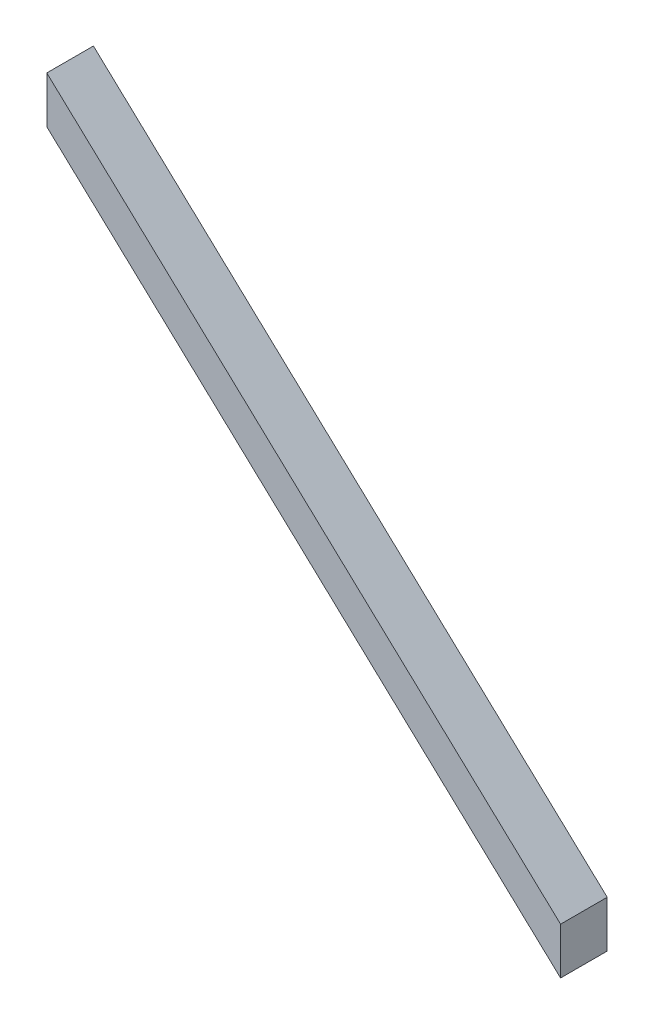
ISO-10303-21;
HEADER;
FILE_DESCRIPTION(('STEP AP214'),'2;1');
FILE_NAME('part.step','',(''),(''),'','','');
FILE_SCHEMA(('AUTOMOTIVE_DESIGN { 1 0 10303 214 1 1 1 1 }'));
ENDSEC;
DATA;
#1=APPLICATION_CONTEXT('core data for automotive mechanical design processes');
#2=APPLICATION_PROTOCOL_DEFINITION('international standard','automotive_design',2000,#1);
#3=PRODUCT_CONTEXT('',#1,'mechanical');
#4=PRODUCT('Part','Part','',(#3));
#5=PRODUCT_RELATED_PRODUCT_CATEGORY('part','',(#4));
#6=PRODUCT_DEFINITION_FORMATION('','',#4);
#7=PRODUCT_DEFINITION_CONTEXT('part definition',#1,'design');
#8=PRODUCT_DEFINITION('design','',#6,#7);
#9=PRODUCT_DEFINITION_SHAPE('','',#8);
#10=(LENGTH_UNIT() NAMED_UNIT(*) SI_UNIT(.MILLI.,.METRE.));
#11=(NAMED_UNIT(*) PLANE_ANGLE_UNIT() SI_UNIT($,.RADIAN.));
#12=(NAMED_UNIT(*) SI_UNIT($,.STERADIAN.) SOLID_ANGLE_UNIT());
#13=UNCERTAINTY_MEASURE_WITH_UNIT(LENGTH_MEASURE(1.E-05),#10,'distance_accuracy_value','');
#14=(GEOMETRIC_REPRESENTATION_CONTEXT(3) GLOBAL_UNCERTAINTY_ASSIGNED_CONTEXT((#13)) GLOBAL_UNIT_ASSIGNED_CONTEXT((#10,
#11,#12)) REPRESENTATION_CONTEXT('',''));
#15=CARTESIAN_POINT('',(0.,0.,0.));
#16=DIRECTION('',(0.,0.,1.));
#17=DIRECTION('',(1.,0.,0.));
#18=AXIS2_PLACEMENT_3D('',#15,#16,#17);
#19=CARTESIAN_POINT('',(21.5982552132406,185.289284442551,-8.00999999999998));
#20=DIRECTION('',(1.,0.,0.));
#21=DIRECTION('',(0.,0.,-1.));
#22=AXIS2_PLACEMENT_3D('',#19,#20,#21);
#23=PLANE('',#22);
#24=DIRECTION('',(0.,-1.,0.));
#25=VECTOR('',#24,1.);
#26=CARTESIAN_POINT('',(21.5982552132406,192.880197559472,-7.99999999999999));
#27=LINE('',#26,#25);
#28=CARTESIAN_POINT('',(21.5982552132406,193.289284442551,-7.99999999999998));
#29=VERTEX_POINT('',#28);
#30=CARTESIAN_POINT('',(21.5982552132406,185.289284442551,-7.99999999999998));
#31=VERTEX_POINT('',#30);
#32=EDGE_CURVE('E48',#29,#31,#27,.T.);
#33=ORIENTED_EDGE('',*,*,#32,.T.);
#34=DIRECTION('',(0.,0.,1.));
#35=VECTOR('',#34,1.);
#36=CARTESIAN_POINT('',(21.5982552132406,185.289284442551,-7.99999999999998));
#37=LINE('',#36,#35);
#38=CARTESIAN_POINT('',(21.5982552132406,185.289284442551,0.));
#39=VERTEX_POINT('',#38);
#40=EDGE_CURVE('E92',#39,#31,#37,.F.);
#41=ORIENTED_EDGE('',*,*,#40,.F.);
#42=DIRECTION('',(0.,-1.,0.));
#43=VECTOR('',#42,1.);
#44=CARTESIAN_POINT('',(21.5982552132406,0.,0.));
#45=LINE('',#44,#43);
#46=CARTESIAN_POINT('',(21.5982552132406,193.289284442551,0.));
#47=VERTEX_POINT('',#46);
#48=EDGE_CURVE('E110',#47,#39,#45,.T.);
#49=ORIENTED_EDGE('',*,*,#48,.F.);
#50=DIRECTION('',(0.,0.,-1.));
#51=VECTOR('',#50,1.);
#52=CARTESIAN_POINT('',(21.5982552132406,193.289284442551,-174.481230173254));
#53=LINE('',#52,#51);
#54=EDGE_CURVE('E12',#47,#29,#53,.T.);
#55=ORIENTED_EDGE('',*,*,#54,.T.);
#56=EDGE_LOOP('',(#33,#41,#49,#55));
#57=FACE_BOUND('',#56,.T.);
#58=ADVANCED_FACE('F45',(#57),#23,.F.);
#59=CARTESIAN_POINT('',(109.756813274208,110.880197559472,-174.481230173254));
#60=DIRECTION('',(1.,0.,0.));
#61=DIRECTION('',(0.,0.,-1.));
#62=AXIS2_PLACEMENT_3D('',#59,#60,#61);
#63=PLANE('',#62);
#64=DIRECTION('',(0.,0.,1.));
#65=VECTOR('',#64,1.);
#66=CARTESIAN_POINT('',(109.756813274208,102.880197559472,-174.481230173254));
#67=LINE('',#66,#65);
#68=CARTESIAN_POINT('',(109.756813274208,102.880197559472,-7.99999999999998));
#69=VERTEX_POINT('',#68);
#70=CARTESIAN_POINT('',(109.756813274208,102.880197559472,0.));
#71=VERTEX_POINT('',#70);
#72=EDGE_CURVE('E89',#69,#71,#67,.T.);
#73=ORIENTED_EDGE('',*,*,#72,.F.);
#74=DIRECTION('',(0.,1.,0.));
#75=VECTOR('',#74,1.);
#76=CARTESIAN_POINT('',(109.756813274208,110.880197559472,-7.99999999999998));
#77=LINE('',#76,#75);
#78=CARTESIAN_POINT('',(109.756813274208,110.880197559472,-7.99999999999998));
#79=VERTEX_POINT('',#78);
#80=EDGE_CURVE('E97',#69,#79,#77,.T.);
#81=ORIENTED_EDGE('',*,*,#80,.T.);
#82=DIRECTION('',(0.,0.,1.));
#83=VECTOR('',#82,1.);
#84=CARTESIAN_POINT('',(109.756813274208,110.880197559472,-174.481230173254));
#85=LINE('',#84,#83);
#86=CARTESIAN_POINT('',(109.756813274208,110.880197559472,0.));
#87=VERTEX_POINT('',#86);
#88=EDGE_CURVE('E102',#79,#87,#85,.T.);
#89=ORIENTED_EDGE('',*,*,#88,.T.);
#90=DIRECTION('',(0.,1.,0.));
#91=VECTOR('',#90,1.);
#92=CARTESIAN_POINT('',(109.756813274208,110.880197559472,0.));
#93=LINE('',#92,#91);
#94=EDGE_CURVE('E106',#71,#87,#93,.T.);
#95=ORIENTED_EDGE('',*,*,#94,.F.);
#96=EDGE_LOOP('',(#73,#81,#89,#95));
#97=FACE_BOUND('',#96,.T.);
#98=ADVANCED_FACE('F104',(#97),#63,.T.);
#99=CARTESIAN_POINT('',(9.75681327421035,192.880197559472,-7.99999999999999));
#100=DIRECTION('',(0.,0.,-1.));
#101=DIRECTION('',(0.,-1.,0.));
#102=AXIS2_PLACEMENT_3D('',#99,#100,#101);
#103=PLANE('',#102);
#104=ORIENTED_EDGE('',*,*,#32,.F.);
#105=DIRECTION('',(-0.730526939324927,0.682883878064606,0.));
#106=VECTOR('',#105,1.);
#107=CARTESIAN_POINT('',(17.7568132742084,196.880197559472,-7.99999999999998));
#108=LINE('',#107,#106);
#109=EDGE_CURVE('E99',#79,#29,#108,.T.);
#110=ORIENTED_EDGE('',*,*,#109,.F.);
#111=ORIENTED_EDGE('',*,*,#80,.F.);
#112=DIRECTION('',(0.730526939324927,-0.682883878064605,0.));
#113=VECTOR('',#112,1.);
#114=CARTESIAN_POINT('',(20.7568132742084,186.075849733385,-7.99999999999998));
#115=LINE('',#114,#113);
#116=EDGE_CURVE('E84',#31,#69,#115,.T.);
#117=ORIENTED_EDGE('',*,*,#116,.F.);
#118=EDGE_LOOP('',(#104,#110,#111,#117));
#119=FACE_BOUND('',#118,.T.);
#120=ADVANCED_FACE('F98',(#119),#103,.T.);
#121=CARTESIAN_POINT('',(0.,0.,0.));
#122=DIRECTION('',(0.,0.,-1.));
#123=DIRECTION('',(-1.,0.,0.));
#124=AXIS2_PLACEMENT_3D('',#121,#122,#123);
#125=PLANE('',#124);
#126=DIRECTION('',(-0.730526939324927,0.682883878064606,0.));
#127=VECTOR('',#126,1.);
#128=CARTESIAN_POINT('',(17.7568132742083,196.880197559472,0.));
#129=LINE('',#128,#127);
#130=EDGE_CURVE('E94',#87,#47,#129,.T.);
#131=ORIENTED_EDGE('',*,*,#130,.T.);
#132=ORIENTED_EDGE('',*,*,#48,.T.);
#133=DIRECTION('',(0.730526939324927,-0.682883878064605,0.));
#134=VECTOR('',#133,1.);
#135=CARTESIAN_POINT('',(20.7568132742083,186.075849733385,0.));
#136=LINE('',#135,#134);
#137=EDGE_CURVE('E116',#39,#71,#136,.T.);
#138=ORIENTED_EDGE('',*,*,#137,.T.);
#139=ORIENTED_EDGE('',*,*,#94,.T.);
#140=EDGE_LOOP('',(#131,#132,#138,#139));
#141=FACE_BOUND('',#140,.T.);
#142=ADVANCED_FACE('F119',(#141),#125,.F.);
#143=CARTESIAN_POINT('',(20.7568132742083,186.075849733385,-174.481230173254));
#144=DIRECTION('',(-0.682883878064605,-0.730526939324927,0.));
#145=DIRECTION('',(0.730526939324927,-0.682883878064605,0.));
#146=AXIS2_PLACEMENT_3D('',#143,#144,#145);
#147=PLANE('',#146);
#148=ORIENTED_EDGE('',*,*,#137,.F.);
#149=ORIENTED_EDGE('',*,*,#40,.T.);
#150=ORIENTED_EDGE('',*,*,#116,.T.);
#151=ORIENTED_EDGE('',*,*,#72,.T.);
#152=EDGE_LOOP('',(#148,#149,#150,#151));
#153=FACE_BOUND('',#152,.T.);
#154=ADVANCED_FACE('F87',(#153),#147,.T.);
#155=CARTESIAN_POINT('',(17.7568132742083,196.880197559472,-174.481230173254));
#156=DIRECTION('',(0.682883878064605,0.730526939324927,0.));
#157=DIRECTION('',(-0.730526939324927,0.682883878064606,0.));
#158=AXIS2_PLACEMENT_3D('',#155,#156,#157);
#159=PLANE('',#158);
#160=ORIENTED_EDGE('',*,*,#54,.F.);
#161=ORIENTED_EDGE('',*,*,#130,.F.);
#162=ORIENTED_EDGE('',*,*,#88,.F.);
#163=ORIENTED_EDGE('',*,*,#109,.T.);
#164=EDGE_LOOP('',(#160,#161,#162,#163));
#165=FACE_BOUND('',#164,.T.);
#166=ADVANCED_FACE('F113',(#165),#159,.T.);
#167=CLOSED_SHELL('',(#58,#98,#120,#142,#154,#166));
#168=MANIFOLD_SOLID_BREP('B2',#167);
#169=ADVANCED_BREP_SHAPE_REPRESENTATION('',(#18,#168),#14);
#170=SHAPE_DEFINITION_REPRESENTATION(#9,#169);
ENDSEC;
END-ISO-10303-21;
